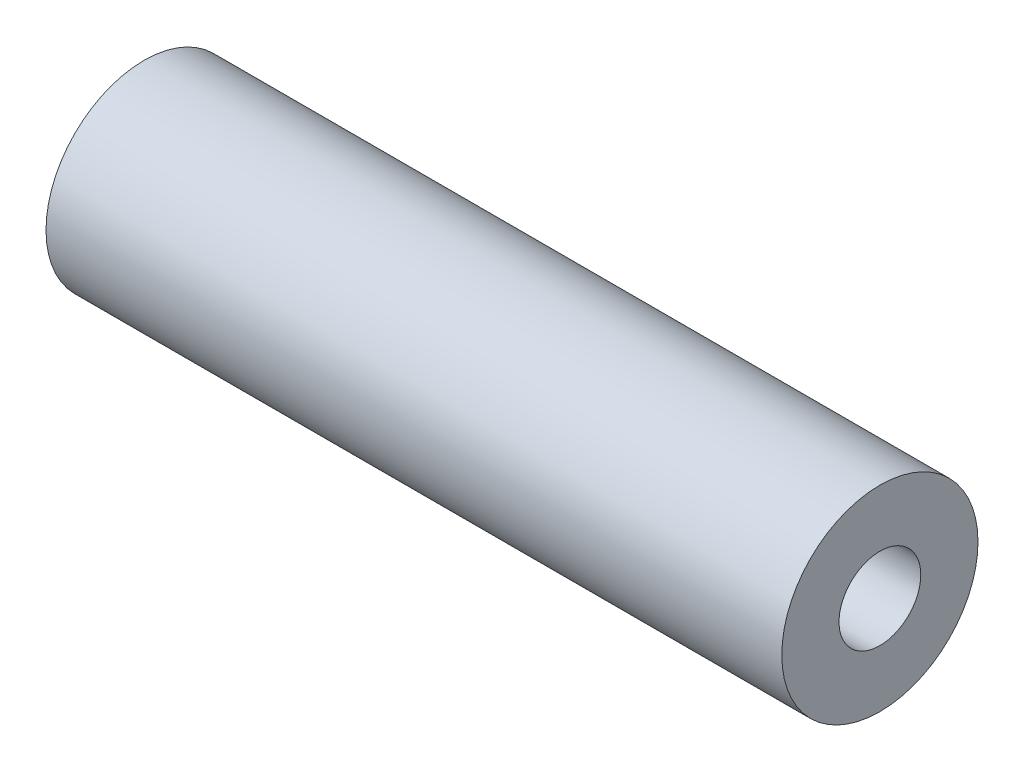
ISO-10303-21;
HEADER;
FILE_DESCRIPTION(('STEP AP214'),'2;1');
FILE_NAME('part.step','',(''),(''),'','','');
FILE_SCHEMA(('AUTOMOTIVE_DESIGN { 1 0 10303 214 1 1 1 1 }'));
ENDSEC;
DATA;
#1=APPLICATION_CONTEXT('core data for automotive mechanical design processes');
#2=APPLICATION_PROTOCOL_DEFINITION('international standard','automotive_design',2000,#1);
#3=PRODUCT_CONTEXT('',#1,'mechanical');
#4=PRODUCT('Part','Part','',(#3));
#5=PRODUCT_RELATED_PRODUCT_CATEGORY('part','',(#4));
#6=PRODUCT_DEFINITION_FORMATION('','',#4);
#7=PRODUCT_DEFINITION_CONTEXT('part definition',#1,'design');
#8=PRODUCT_DEFINITION('design','',#6,#7);
#9=PRODUCT_DEFINITION_SHAPE('','',#8);
#10=(LENGTH_UNIT() NAMED_UNIT(*) SI_UNIT(.MILLI.,.METRE.));
#11=(NAMED_UNIT(*) PLANE_ANGLE_UNIT() SI_UNIT($,.RADIAN.));
#12=(NAMED_UNIT(*) SI_UNIT($,.STERADIAN.) SOLID_ANGLE_UNIT());
#13=UNCERTAINTY_MEASURE_WITH_UNIT(LENGTH_MEASURE(1.E-05),#10,'distance_accuracy_value','');
#14=(GEOMETRIC_REPRESENTATION_CONTEXT(3) GLOBAL_UNCERTAINTY_ASSIGNED_CONTEXT((#13)) GLOBAL_UNIT_ASSIGNED_CONTEXT((#10,
#11,#12)) REPRESENTATION_CONTEXT('',''));
#15=CARTESIAN_POINT('',(0.,0.,0.));
#16=DIRECTION('',(0.,0.,1.));
#17=DIRECTION('',(1.,0.,0.));
#18=AXIS2_PLACEMENT_3D('',#15,#16,#17);
#19=CARTESIAN_POINT('',(55.35,0.,0.));
#20=DIRECTION('',(1.,0.,0.));
#21=DIRECTION('',(0.,0.,-1.));
#22=AXIS2_PLACEMENT_3D('',#19,#20,#21);
#23=PLANE('',#22);
#24=CARTESIAN_POINT('',(55.35,0.,0.));
#25=DIRECTION('',(1.,0.,0.));
#26=DIRECTION('',(0.,0.,-1.));
#27=AXIS2_PLACEMENT_3D('',#24,#25,#26);
#28=CIRCLE('',#27,7.56);
#29=CARTESIAN_POINT('',(55.35,0.,-7.56));
#30=VERTEX_POINT('',#29);
#31=EDGE_CURVE('E12',#30,#30,#28,.T.);
#32=ORIENTED_EDGE('',*,*,#31,.T.);
#33=EDGE_LOOP('',(#32));
#34=FACE_BOUND('',#33,.T.);
#35=CARTESIAN_POINT('',(55.35,0.,0.));
#36=DIRECTION('',(1.,0.,0.));
#37=DIRECTION('',(0.,0.,-1.));
#38=AXIS2_PLACEMENT_3D('',#35,#36,#37);
#39=CIRCLE('',#38,3.15);
#40=CARTESIAN_POINT('',(55.35,0.,-3.15));
#41=VERTEX_POINT('',#40);
#42=EDGE_CURVE('E56',#41,#41,#39,.T.);
#43=ORIENTED_EDGE('',*,*,#42,.F.);
#44=EDGE_LOOP('',(#43));
#45=FACE_BOUND('',#44,.T.);
#46=ADVANCED_FACE('F45',(#34,#45),#23,.T.);
#47=CARTESIAN_POINT('',(-1.35,0.,0.));
#48=DIRECTION('',(1.,0.,0.));
#49=DIRECTION('',(0.,0.,-1.));
#50=AXIS2_PLACEMENT_3D('',#47,#48,#49);
#51=PLANE('',#50);
#52=CARTESIAN_POINT('',(-1.35,0.,0.));
#53=DIRECTION('',(1.,0.,0.));
#54=DIRECTION('',(0.,0.,-1.));
#55=AXIS2_PLACEMENT_3D('',#52,#53,#54);
#56=CIRCLE('',#55,7.56);
#57=CARTESIAN_POINT('',(-1.35,0.,-7.56));
#58=VERTEX_POINT('',#57);
#59=EDGE_CURVE('E49',#58,#58,#56,.T.);
#60=ORIENTED_EDGE('',*,*,#59,.F.);
#61=EDGE_LOOP('',(#60));
#62=FACE_BOUND('',#61,.T.);
#63=CARTESIAN_POINT('',(-1.35,0.,0.));
#64=DIRECTION('',(1.,0.,0.));
#65=DIRECTION('',(0.,0.,-1.));
#66=AXIS2_PLACEMENT_3D('',#63,#64,#65);
#67=CIRCLE('',#66,3.15);
#68=CARTESIAN_POINT('',(-1.35,0.,-3.15));
#69=VERTEX_POINT('',#68);
#70=EDGE_CURVE('E58',#69,#69,#67,.T.);
#71=ORIENTED_EDGE('',*,*,#70,.T.);
#72=EDGE_LOOP('',(#71));
#73=FACE_BOUND('',#72,.T.);
#74=ADVANCED_FACE('F68',(#62,#73),#51,.F.);
#75=CARTESIAN_POINT('',(55.35,0.,0.));
#76=DIRECTION('',(-1.,0.,0.));
#77=DIRECTION('',(0.,0.,1.));
#78=AXIS2_PLACEMENT_3D('',#75,#76,#77);
#79=CYLINDRICAL_SURFACE('',#78,7.56);
#80=ORIENTED_EDGE('',*,*,#31,.F.);
#81=EDGE_LOOP('',(#80));
#82=FACE_BOUND('',#81,.T.);
#83=ORIENTED_EDGE('',*,*,#59,.T.);
#84=EDGE_LOOP('',(#83));
#85=FACE_BOUND('',#84,.T.);
#86=ADVANCED_FACE('F47',(#82,#85),#79,.T.);
#87=CARTESIAN_POINT('',(55.35,0.,0.));
#88=DIRECTION('',(-1.,0.,0.));
#89=DIRECTION('',(0.,0.,1.));
#90=AXIS2_PLACEMENT_3D('',#87,#88,#89);
#91=CYLINDRICAL_SURFACE('',#90,3.15);
#92=ORIENTED_EDGE('',*,*,#42,.T.);
#93=EDGE_LOOP('',(#92));
#94=FACE_BOUND('',#93,.T.);
#95=ORIENTED_EDGE('',*,*,#70,.F.);
#96=EDGE_LOOP('',(#95));
#97=FACE_BOUND('',#96,.T.);
#98=ADVANCED_FACE('F64',(#94,#97),#91,.F.);
#99=CLOSED_SHELL('',(#46,#74,#86,#98));
#100=MANIFOLD_SOLID_BREP('B2',#99);
#101=ADVANCED_BREP_SHAPE_REPRESENTATION('',(#18,#100),#14);
#102=SHAPE_DEFINITION_REPRESENTATION(#9,#101);
ENDSEC;
END-ISO-10303-21;
